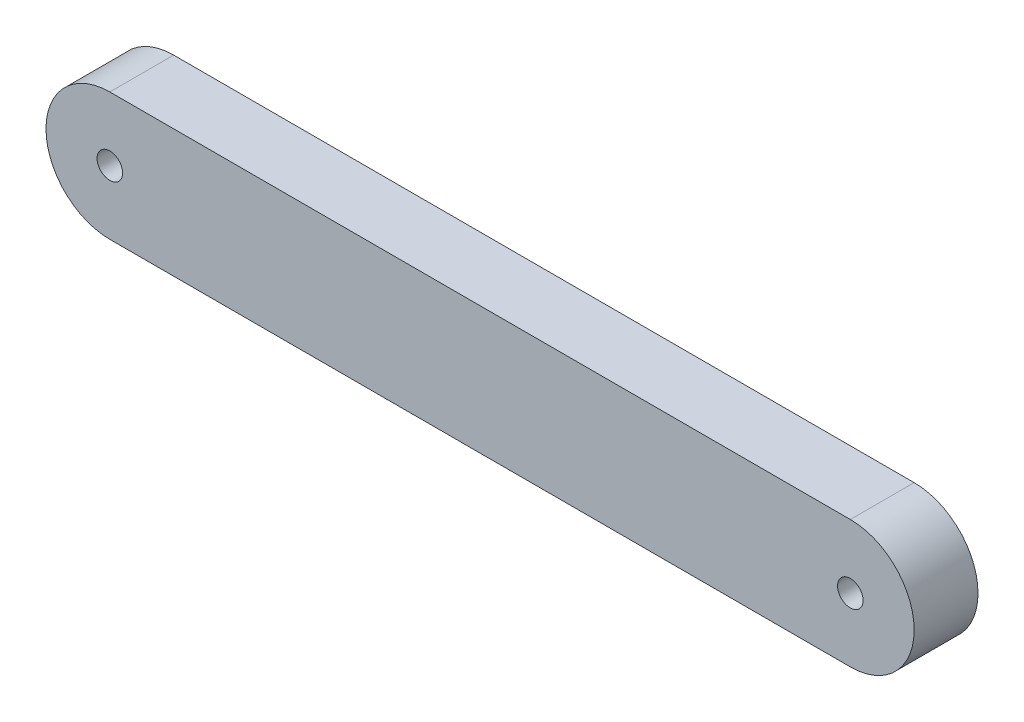
ISO-10303-21;
HEADER;
FILE_DESCRIPTION(('STEP AP214'),'2;1');
FILE_NAME('part.step','',(''),(''),'','','');
FILE_SCHEMA(('AUTOMOTIVE_DESIGN { 1 0 10303 214 1 1 1 1 }'));
ENDSEC;
DATA;
#1=APPLICATION_CONTEXT('core data for automotive mechanical design processes');
#2=APPLICATION_PROTOCOL_DEFINITION('international standard','automotive_design',2000,#1);
#3=PRODUCT_CONTEXT('',#1,'mechanical');
#4=PRODUCT('Part','Part','',(#3));
#5=PRODUCT_RELATED_PRODUCT_CATEGORY('part','',(#4));
#6=PRODUCT_DEFINITION_FORMATION('','',#4);
#7=PRODUCT_DEFINITION_CONTEXT('part definition',#1,'design');
#8=PRODUCT_DEFINITION('design','',#6,#7);
#9=PRODUCT_DEFINITION_SHAPE('','',#8);
#10=(LENGTH_UNIT() NAMED_UNIT(*) SI_UNIT(.MILLI.,.METRE.));
#11=(NAMED_UNIT(*) PLANE_ANGLE_UNIT() SI_UNIT($,.RADIAN.));
#12=(NAMED_UNIT(*) SI_UNIT($,.STERADIAN.) SOLID_ANGLE_UNIT());
#13=UNCERTAINTY_MEASURE_WITH_UNIT(LENGTH_MEASURE(1.E-05),#10,'distance_accuracy_value','');
#14=(GEOMETRIC_REPRESENTATION_CONTEXT(3) GLOBAL_UNCERTAINTY_ASSIGNED_CONTEXT((#13)) GLOBAL_UNIT_ASSIGNED_CONTEXT((#10,
#11,#12)) REPRESENTATION_CONTEXT('',''));
#15=CARTESIAN_POINT('',(0.,0.,0.));
#16=DIRECTION('',(0.,0.,1.));
#17=DIRECTION('',(1.,0.,0.));
#18=AXIS2_PLACEMENT_3D('',#15,#16,#17);
#19=CARTESIAN_POINT('',(-77.2328308207705,7.5041876046901,10.));
#20=DIRECTION('',(0.,0.,1.));
#21=DIRECTION('',(1.,0.,0.));
#22=AXIS2_PLACEMENT_3D('',#19,#20,#21);
#23=PLANE('',#22);
#24=CARTESIAN_POINT('',(-193.23283082077,7.50418760469013,10.));
#25=DIRECTION('',(0.,0.,1.));
#26=DIRECTION('',(1.,0.,0.));
#27=AXIS2_PLACEMENT_3D('',#24,#25,#26);
#28=CIRCLE('',#27,2.);
#29=CARTESIAN_POINT('',(-191.23283082077,7.50418760469013,10.));
#30=VERTEX_POINT('',#29);
#31=EDGE_CURVE('E102',#30,#30,#28,.T.);
#32=ORIENTED_EDGE('',*,*,#31,.F.);
#33=EDGE_LOOP('',(#32));
#34=FACE_BOUND('',#33,.T.);
#35=CARTESIAN_POINT('',(-77.2328308207705,7.5041876046901,10.));
#36=DIRECTION('',(0.,0.,1.));
#37=DIRECTION('',(1.,0.,0.));
#38=AXIS2_PLACEMENT_3D('',#35,#36,#37);
#39=CIRCLE('',#38,10.);
#40=CARTESIAN_POINT('',(-77.2328308207705,-2.4958123953099,10.));
#41=VERTEX_POINT('',#40);
#42=CARTESIAN_POINT('',(-77.2328308207705,17.5041876046901,10.));
#43=VERTEX_POINT('',#42);
#44=EDGE_CURVE('E87',#41,#43,#39,.T.);
#45=ORIENTED_EDGE('',*,*,#44,.T.);
#46=DIRECTION('',(-1.,0.,0.));
#47=VECTOR('',#46,1.);
#48=CARTESIAN_POINT('',(-77.2328308207705,17.5041876046901,10.));
#49=LINE('',#48,#47);
#50=CARTESIAN_POINT('',(-193.23283082077,17.5041876046901,10.));
#51=VERTEX_POINT('',#50);
#52=EDGE_CURVE('E82',#43,#51,#49,.T.);
#53=ORIENTED_EDGE('',*,*,#52,.T.);
#54=CARTESIAN_POINT('',(-193.23283082077,7.50418760469013,10.));
#55=DIRECTION('',(0.,0.,1.));
#56=DIRECTION('',(1.,0.,0.));
#57=AXIS2_PLACEMENT_3D('',#54,#55,#56);
#58=CIRCLE('',#57,10.);
#59=CARTESIAN_POINT('',(-193.23283082077,-2.49581239530991,10.));
#60=VERTEX_POINT('',#59);
#61=EDGE_CURVE('E85',#51,#60,#58,.T.);
#62=ORIENTED_EDGE('',*,*,#61,.T.);
#63=DIRECTION('',(1.,0.,0.));
#64=VECTOR('',#63,1.);
#65=CARTESIAN_POINT('',(-77.2328308207705,-2.4958123953099,10.));
#66=LINE('',#65,#64);
#67=EDGE_CURVE('E52',#60,#41,#66,.T.);
#68=ORIENTED_EDGE('',*,*,#67,.T.);
#69=EDGE_LOOP('',(#45,#53,#62,#68));
#70=FACE_BOUND('',#69,.T.);
#71=CARTESIAN_POINT('',(-77.2328308207705,7.5041876046901,10.));
#72=DIRECTION('',(0.,0.,1.));
#73=DIRECTION('',(1.,0.,0.));
#74=AXIS2_PLACEMENT_3D('',#71,#72,#73);
#75=CIRCLE('',#74,2.);
#76=CARTESIAN_POINT('',(-75.2328308207705,7.5041876046901,10.));
#77=VERTEX_POINT('',#76);
#78=EDGE_CURVE('E117',#77,#77,#75,.T.);
#79=ORIENTED_EDGE('',*,*,#78,.F.);
#80=EDGE_LOOP('',(#79));
#81=FACE_BOUND('',#80,.T.);
#82=ADVANCED_FACE('F35',(#34,#70,#81),#23,.T.);
#83=CARTESIAN_POINT('',(-77.2328308207705,7.5041876046901,0.));
#84=DIRECTION('',(0.,0.,1.));
#85=DIRECTION('',(1.,0.,0.));
#86=AXIS2_PLACEMENT_3D('',#83,#84,#85);
#87=PLANE('',#86);
#88=CARTESIAN_POINT('',(-77.2328308207705,7.5041876046901,0.));
#89=DIRECTION('',(0.,0.,1.));
#90=DIRECTION('',(1.,0.,0.));
#91=AXIS2_PLACEMENT_3D('',#88,#89,#90);
#92=CIRCLE('',#91,10.);
#93=CARTESIAN_POINT('',(-77.2328308207705,-2.4958123953099,0.));
#94=VERTEX_POINT('',#93);
#95=CARTESIAN_POINT('',(-77.2328308207705,17.5041876046901,0.));
#96=VERTEX_POINT('',#95);
#97=EDGE_CURVE('E99',#94,#96,#92,.T.);
#98=ORIENTED_EDGE('',*,*,#97,.F.);
#99=DIRECTION('',(1.,0.,0.));
#100=VECTOR('',#99,1.);
#101=CARTESIAN_POINT('',(-77.2328308207705,-2.4958123953099,0.));
#102=LINE('',#101,#100);
#103=CARTESIAN_POINT('',(-193.23283082077,-2.49581239530991,0.));
#104=VERTEX_POINT('',#103);
#105=EDGE_CURVE('E75',#104,#94,#102,.T.);
#106=ORIENTED_EDGE('',*,*,#105,.F.);
#107=CARTESIAN_POINT('',(-193.23283082077,7.50418760469013,0.));
#108=DIRECTION('',(0.,0.,1.));
#109=DIRECTION('',(1.,0.,0.));
#110=AXIS2_PLACEMENT_3D('',#107,#108,#109);
#111=CIRCLE('',#110,10.);
#112=CARTESIAN_POINT('',(-193.23283082077,17.5041876046901,0.));
#113=VERTEX_POINT('',#112);
#114=EDGE_CURVE('E69',#113,#104,#111,.T.);
#115=ORIENTED_EDGE('',*,*,#114,.F.);
#116=DIRECTION('',(-1.,0.,0.));
#117=VECTOR('',#116,1.);
#118=CARTESIAN_POINT('',(-77.2328308207705,17.5041876046901,0.));
#119=LINE('',#118,#117);
#120=EDGE_CURVE('E91',#96,#113,#119,.T.);
#121=ORIENTED_EDGE('',*,*,#120,.F.);
#122=EDGE_LOOP('',(#98,#106,#115,#121));
#123=FACE_BOUND('',#122,.T.);
#124=CARTESIAN_POINT('',(-193.23283082077,7.50418760469013,0.));
#125=DIRECTION('',(0.,0.,1.));
#126=DIRECTION('',(1.,0.,0.));
#127=AXIS2_PLACEMENT_3D('',#124,#125,#126);
#128=CIRCLE('',#127,2.);
#129=CARTESIAN_POINT('',(-191.23283082077,7.50418760469013,0.));
#130=VERTEX_POINT('',#129);
#131=EDGE_CURVE('E114',#130,#130,#128,.T.);
#132=ORIENTED_EDGE('',*,*,#131,.T.);
#133=EDGE_LOOP('',(#132));
#134=FACE_BOUND('',#133,.T.);
#135=CARTESIAN_POINT('',(-77.2328308207705,7.5041876046901,0.));
#136=DIRECTION('',(0.,0.,1.));
#137=DIRECTION('',(1.,0.,0.));
#138=AXIS2_PLACEMENT_3D('',#135,#136,#137);
#139=CIRCLE('',#138,2.);
#140=CARTESIAN_POINT('',(-75.2328308207705,7.5041876046901,0.));
#141=VERTEX_POINT('',#140);
#142=EDGE_CURVE('E120',#141,#141,#139,.T.);
#143=ORIENTED_EDGE('',*,*,#142,.T.);
#144=EDGE_LOOP('',(#143));
#145=FACE_BOUND('',#144,.T.);
#146=ADVANCED_FACE('F110',(#123,#134,#145),#87,.F.);
#147=CARTESIAN_POINT('',(-77.2328308207705,7.5041876046901,10.));
#148=DIRECTION('',(0.,0.,-1.));
#149=DIRECTION('',(-1.,0.,0.));
#150=AXIS2_PLACEMENT_3D('',#147,#148,#149);
#151=CYLINDRICAL_SURFACE('',#150,10.);
#152=ORIENTED_EDGE('',*,*,#97,.T.);
#153=DIRECTION('',(0.,0.,-1.));
#154=VECTOR('',#153,1.);
#155=CARTESIAN_POINT('',(-77.2328308207705,17.5041876046901,10.));
#156=LINE('',#155,#154);
#157=EDGE_CURVE('E11',#43,#96,#156,.T.);
#158=ORIENTED_EDGE('',*,*,#157,.F.);
#159=ORIENTED_EDGE('',*,*,#44,.F.);
#160=DIRECTION('',(0.,0.,-1.));
#161=VECTOR('',#160,1.);
#162=CARTESIAN_POINT('',(-77.2328308207705,-2.4958123953099,10.));
#163=LINE('',#162,#161);
#164=EDGE_CURVE('E95',#41,#94,#163,.T.);
#165=ORIENTED_EDGE('',*,*,#164,.T.);
#166=EDGE_LOOP('',(#152,#158,#159,#165));
#167=FACE_BOUND('',#166,.T.);
#168=ADVANCED_FACE('F37',(#167),#151,.T.);
#169=CARTESIAN_POINT('',(-77.2328308207705,17.5041876046901,10.));
#170=DIRECTION('',(0.,-1.,0.));
#171=DIRECTION('',(1.,0.,0.));
#172=AXIS2_PLACEMENT_3D('',#169,#170,#171);
#173=PLANE('',#172);
#174=ORIENTED_EDGE('',*,*,#120,.T.);
#175=DIRECTION('',(0.,0.,-1.));
#176=VECTOR('',#175,1.);
#177=CARTESIAN_POINT('',(-193.23283082077,17.5041876046901,10.));
#178=LINE('',#177,#176);
#179=EDGE_CURVE('E44',#51,#113,#178,.T.);
#180=ORIENTED_EDGE('',*,*,#179,.F.);
#181=ORIENTED_EDGE('',*,*,#52,.F.);
#182=ORIENTED_EDGE('',*,*,#157,.T.);
#183=EDGE_LOOP('',(#174,#180,#181,#182));
#184=FACE_BOUND('',#183,.T.);
#185=ADVANCED_FACE('F90',(#184),#173,.F.);
#186=CARTESIAN_POINT('',(-193.23283082077,7.50418760469013,10.));
#187=DIRECTION('',(0.,0.,-1.));
#188=DIRECTION('',(-1.,0.,0.));
#189=AXIS2_PLACEMENT_3D('',#186,#187,#188);
#190=CYLINDRICAL_SURFACE('',#189,10.);
#191=ORIENTED_EDGE('',*,*,#114,.T.);
#192=DIRECTION('',(0.,0.,-1.));
#193=VECTOR('',#192,1.);
#194=CARTESIAN_POINT('',(-193.23283082077,-2.49581239530991,10.));
#195=LINE('',#194,#193);
#196=EDGE_CURVE('E92',#60,#104,#195,.T.);
#197=ORIENTED_EDGE('',*,*,#196,.F.);
#198=ORIENTED_EDGE('',*,*,#61,.F.);
#199=ORIENTED_EDGE('',*,*,#179,.T.);
#200=EDGE_LOOP('',(#191,#197,#198,#199));
#201=FACE_BOUND('',#200,.T.);
#202=ADVANCED_FACE('F93',(#201),#190,.T.);
#203=CARTESIAN_POINT('',(-77.2328308207705,-2.4958123953099,10.));
#204=DIRECTION('',(0.,1.,0.));
#205=DIRECTION('',(-1.,0.,0.));
#206=AXIS2_PLACEMENT_3D('',#203,#204,#205);
#207=PLANE('',#206);
#208=ORIENTED_EDGE('',*,*,#105,.T.);
#209=ORIENTED_EDGE('',*,*,#164,.F.);
#210=ORIENTED_EDGE('',*,*,#67,.F.);
#211=ORIENTED_EDGE('',*,*,#196,.T.);
#212=EDGE_LOOP('',(#208,#209,#210,#211));
#213=FACE_BOUND('',#212,.T.);
#214=ADVANCED_FACE('F107',(#213),#207,.F.);
#215=CARTESIAN_POINT('',(-193.23283082077,7.50418760469013,10.));
#216=DIRECTION('',(0.,0.,-1.));
#217=DIRECTION('',(-1.,0.,0.));
#218=AXIS2_PLACEMENT_3D('',#215,#216,#217);
#219=CYLINDRICAL_SURFACE('',#218,2.);
#220=ORIENTED_EDGE('',*,*,#31,.T.);
#221=EDGE_LOOP('',(#220));
#222=FACE_BOUND('',#221,.T.);
#223=ORIENTED_EDGE('',*,*,#131,.F.);
#224=EDGE_LOOP('',(#223));
#225=FACE_BOUND('',#224,.T.);
#226=ADVANCED_FACE('F137',(#222,#225),#219,.F.);
#227=CARTESIAN_POINT('',(-77.2328308207705,7.5041876046901,10.));
#228=DIRECTION('',(0.,0.,-1.));
#229=DIRECTION('',(-1.,0.,0.));
#230=AXIS2_PLACEMENT_3D('',#227,#228,#229);
#231=CYLINDRICAL_SURFACE('',#230,2.);
#232=ORIENTED_EDGE('',*,*,#78,.T.);
#233=EDGE_LOOP('',(#232));
#234=FACE_BOUND('',#233,.T.);
#235=ORIENTED_EDGE('',*,*,#142,.F.);
#236=EDGE_LOOP('',(#235));
#237=FACE_BOUND('',#236,.T.);
#238=ADVANCED_FACE('F126',(#234,#237),#231,.F.);
#239=CLOSED_SHELL('',(#82,#146,#168,#185,#202,#214,#226,#238));
#240=MANIFOLD_SOLID_BREP('B2',#239);
#241=ADVANCED_BREP_SHAPE_REPRESENTATION('',(#18,#240),#14);
#242=SHAPE_DEFINITION_REPRESENTATION(#9,#241);
ENDSEC;
END-ISO-10303-21;
